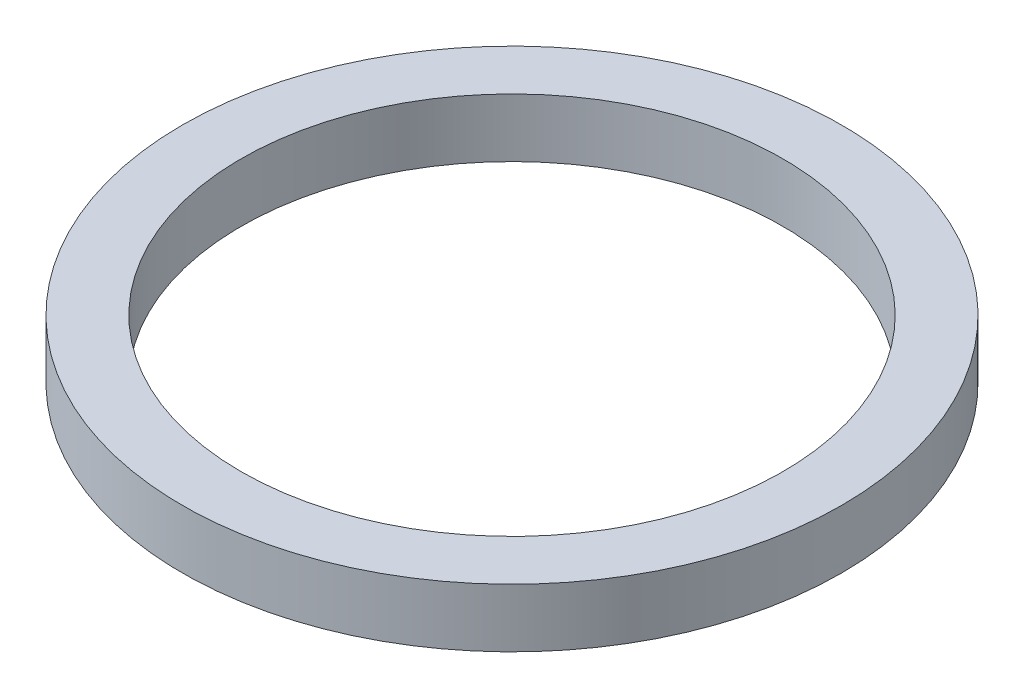
ISO-10303-21;
HEADER;
FILE_DESCRIPTION(('STEP AP214'),'2;1');
FILE_NAME('part.step','',(''),(''),'','','');
FILE_SCHEMA(('AUTOMOTIVE_DESIGN { 1 0 10303 214 1 1 1 1 }'));
ENDSEC;
DATA;
#1=APPLICATION_CONTEXT('core data for automotive mechanical design processes');
#2=APPLICATION_PROTOCOL_DEFINITION('international standard','automotive_design',2000,#1);
#3=PRODUCT_CONTEXT('',#1,'mechanical');
#4=PRODUCT('Part','Part','',(#3));
#5=PRODUCT_RELATED_PRODUCT_CATEGORY('part','',(#4));
#6=PRODUCT_DEFINITION_FORMATION('','',#4);
#7=PRODUCT_DEFINITION_CONTEXT('part definition',#1,'design');
#8=PRODUCT_DEFINITION('design','',#6,#7);
#9=PRODUCT_DEFINITION_SHAPE('','',#8);
#10=(LENGTH_UNIT() NAMED_UNIT(*) SI_UNIT(.MILLI.,.METRE.));
#11=(NAMED_UNIT(*) PLANE_ANGLE_UNIT() SI_UNIT($,.RADIAN.));
#12=(NAMED_UNIT(*) SI_UNIT($,.STERADIAN.) SOLID_ANGLE_UNIT());
#13=UNCERTAINTY_MEASURE_WITH_UNIT(LENGTH_MEASURE(1.E-05),#10,'distance_accuracy_value','');
#14=(GEOMETRIC_REPRESENTATION_CONTEXT(3) GLOBAL_UNCERTAINTY_ASSIGNED_CONTEXT((#13)) GLOBAL_UNIT_ASSIGNED_CONTEXT((#10,
#11,#12)) REPRESENTATION_CONTEXT('',''));
#15=CARTESIAN_POINT('',(0.,0.,0.));
#16=DIRECTION('',(0.,0.,1.));
#17=DIRECTION('',(1.,0.,0.));
#18=AXIS2_PLACEMENT_3D('',#15,#16,#17);
#19=CARTESIAN_POINT('',(0.,50.8,0.));
#20=DIRECTION('',(0.,1.,0.));
#21=DIRECTION('',(0.,0.,1.));
#22=AXIS2_PLACEMENT_3D('',#19,#20,#21);
#23=PLANE('',#22);
#24=CARTESIAN_POINT('',(0.,50.8,0.));
#25=DIRECTION('',(0.,1.,0.));
#26=DIRECTION('',(1.,0.,0.));
#27=AXIS2_PLACEMENT_3D('',#24,#25,#26);
#28=CIRCLE('',#27,285.75);
#29=CARTESIAN_POINT('',(285.75,50.8,0.));
#30=VERTEX_POINT('',#29);
#31=EDGE_CURVE('E11',#30,#30,#28,.T.);
#32=ORIENTED_EDGE('',*,*,#31,.T.);
#33=EDGE_LOOP('',(#32));
#34=FACE_BOUND('',#33,.T.);
#35=CARTESIAN_POINT('',(0.,50.8,0.));
#36=DIRECTION('',(0.,1.,0.));
#37=DIRECTION('',(0.,0.,1.));
#38=AXIS2_PLACEMENT_3D('',#35,#36,#37);
#39=CIRCLE('',#38,234.95);
#40=CARTESIAN_POINT('',(0.,50.8,234.95));
#41=VERTEX_POINT('',#40);
#42=EDGE_CURVE('E48',#41,#41,#39,.T.);
#43=ORIENTED_EDGE('',*,*,#42,.F.);
#44=EDGE_LOOP('',(#43));
#45=FACE_BOUND('',#44,.T.);
#46=ADVANCED_FACE('F37',(#34,#45),#23,.T.);
#47=CARTESIAN_POINT('',(0.,0.,0.));
#48=DIRECTION('',(0.,1.,0.));
#49=DIRECTION('',(0.,0.,1.));
#50=AXIS2_PLACEMENT_3D('',#47,#48,#49);
#51=PLANE('',#50);
#52=CARTESIAN_POINT('',(0.,0.,0.));
#53=DIRECTION('',(0.,1.,0.));
#54=DIRECTION('',(1.,0.,0.));
#55=AXIS2_PLACEMENT_3D('',#52,#53,#54);
#56=CIRCLE('',#55,285.75);
#57=CARTESIAN_POINT('',(285.75,0.,0.));
#58=VERTEX_POINT('',#57);
#59=EDGE_CURVE('E41',#58,#58,#56,.T.);
#60=ORIENTED_EDGE('',*,*,#59,.F.);
#61=EDGE_LOOP('',(#60));
#62=FACE_BOUND('',#61,.T.);
#63=CARTESIAN_POINT('',(0.,0.,0.));
#64=DIRECTION('',(0.,1.,0.));
#65=DIRECTION('',(0.,0.,1.));
#66=AXIS2_PLACEMENT_3D('',#63,#64,#65);
#67=CIRCLE('',#66,234.95);
#68=CARTESIAN_POINT('',(0.,0.,234.95));
#69=VERTEX_POINT('',#68);
#70=EDGE_CURVE('E50',#69,#69,#67,.T.);
#71=ORIENTED_EDGE('',*,*,#70,.T.);
#72=EDGE_LOOP('',(#71));
#73=FACE_BOUND('',#72,.T.);
#74=ADVANCED_FACE('F60',(#62,#73),#51,.F.);
#75=CARTESIAN_POINT('',(0.,50.8,0.));
#76=DIRECTION('',(0.,-1.,0.));
#77=DIRECTION('',(0.,0.,-1.));
#78=AXIS2_PLACEMENT_3D('',#75,#76,#77);
#79=CYLINDRICAL_SURFACE('',#78,285.75);
#80=ORIENTED_EDGE('',*,*,#31,.F.);
#81=EDGE_LOOP('',(#80));
#82=FACE_BOUND('',#81,.T.);
#83=ORIENTED_EDGE('',*,*,#59,.T.);
#84=EDGE_LOOP('',(#83));
#85=FACE_BOUND('',#84,.T.);
#86=ADVANCED_FACE('F39',(#82,#85),#79,.T.);
#87=CARTESIAN_POINT('',(0.,50.8,0.));
#88=DIRECTION('',(0.,-1.,0.));
#89=DIRECTION('',(0.,0.,-1.));
#90=AXIS2_PLACEMENT_3D('',#87,#88,#89);
#91=CYLINDRICAL_SURFACE('',#90,234.95);
#92=ORIENTED_EDGE('',*,*,#42,.T.);
#93=EDGE_LOOP('',(#92));
#94=FACE_BOUND('',#93,.T.);
#95=ORIENTED_EDGE('',*,*,#70,.F.);
#96=EDGE_LOOP('',(#95));
#97=FACE_BOUND('',#96,.T.);
#98=ADVANCED_FACE('F56',(#94,#97),#91,.F.);
#99=CLOSED_SHELL('',(#46,#74,#86,#98));
#100=MANIFOLD_SOLID_BREP('B2',#99);
#101=ADVANCED_BREP_SHAPE_REPRESENTATION('',(#18,#100),#14);
#102=SHAPE_DEFINITION_REPRESENTATION(#9,#101);
ENDSEC;
END-ISO-10303-21;
